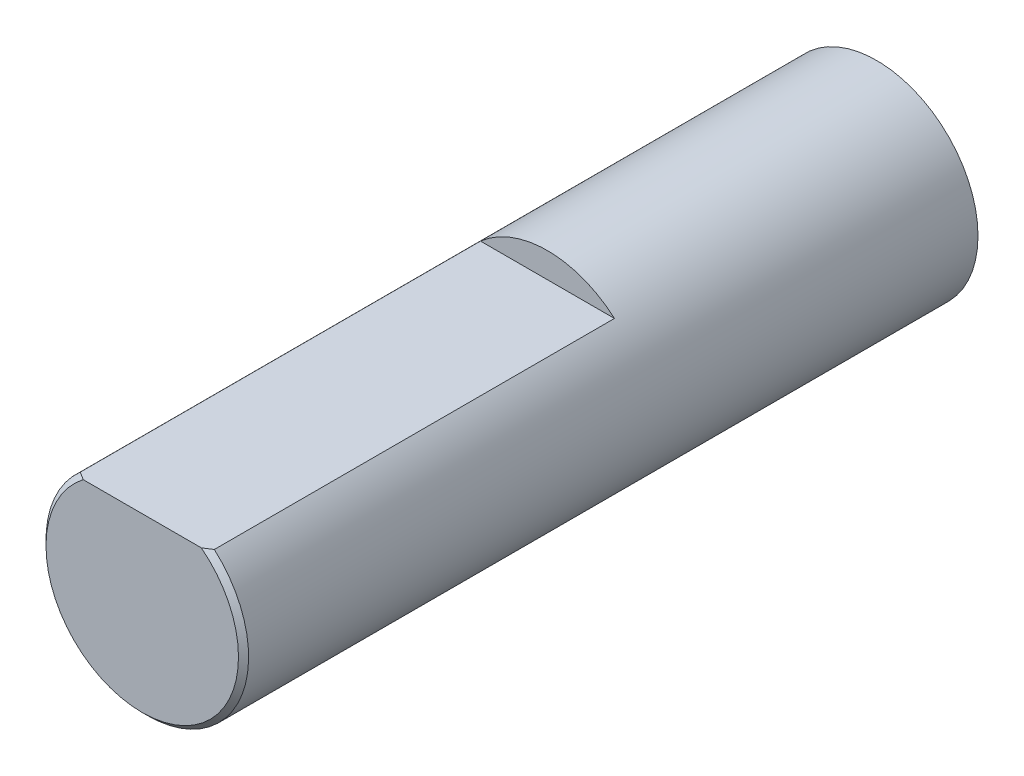
ISO-10303-21;
HEADER;
FILE_DESCRIPTION(('STEP AP214'),'2;1');
FILE_NAME('part.step','',(''),(''),'','','');
FILE_SCHEMA(('AUTOMOTIVE_DESIGN { 1 0 10303 214 1 1 1 1 }'));
ENDSEC;
DATA;
#1=APPLICATION_CONTEXT('core data for automotive mechanical design processes');
#2=APPLICATION_PROTOCOL_DEFINITION('international standard','automotive_design',2000,#1);
#3=PRODUCT_CONTEXT('',#1,'mechanical');
#4=PRODUCT('Part','Part','',(#3));
#5=PRODUCT_RELATED_PRODUCT_CATEGORY('part','',(#4));
#6=PRODUCT_DEFINITION_FORMATION('','',#4);
#7=PRODUCT_DEFINITION_CONTEXT('part definition',#1,'design');
#8=PRODUCT_DEFINITION('design','',#6,#7);
#9=PRODUCT_DEFINITION_SHAPE('','',#8);
#10=(LENGTH_UNIT() NAMED_UNIT(*) SI_UNIT(.MILLI.,.METRE.));
#11=(NAMED_UNIT(*) PLANE_ANGLE_UNIT() SI_UNIT($,.RADIAN.));
#12=(NAMED_UNIT(*) SI_UNIT($,.STERADIAN.) SOLID_ANGLE_UNIT());
#13=UNCERTAINTY_MEASURE_WITH_UNIT(LENGTH_MEASURE(1.E-05),#10,'distance_accuracy_value','');
#14=(GEOMETRIC_REPRESENTATION_CONTEXT(3) GLOBAL_UNCERTAINTY_ASSIGNED_CONTEXT((#13)) GLOBAL_UNIT_ASSIGNED_CONTEXT((#10,
#11,#12)) REPRESENTATION_CONTEXT('',''));
#15=CARTESIAN_POINT('',(0.,0.,0.));
#16=DIRECTION('',(0.,0.,1.));
#17=DIRECTION('',(1.,0.,0.));
#18=AXIS2_PLACEMENT_3D('',#15,#16,#17);
#19=CARTESIAN_POINT('',(0.,0.,14.5));
#20=DIRECTION('',(0.,0.,-1.));
#21=DIRECTION('',(-1.,0.,0.));
#22=AXIS2_PLACEMENT_3D('',#19,#20,#21);
#23=CYLINDRICAL_SURFACE('',#22,2.);
#24=DIRECTION('',(0.,0.,1.));
#25=VECTOR('',#24,1.);
#26=CARTESIAN_POINT('',(1.3228756555323,1.5,6.5));
#27=LINE('',#26,#25);
#28=CARTESIAN_POINT('',(1.3228756555323,1.5,6.5));
#29=VERTEX_POINT('',#28);
#30=CARTESIAN_POINT('',(1.3228756555323,1.5,14.4));
#31=VERTEX_POINT('',#30);
#32=EDGE_CURVE('E80',#29,#31,#27,.T.);
#33=ORIENTED_EDGE('',*,*,#32,.T.);
#34=CARTESIAN_POINT('',(0.,0.,14.4));
#35=DIRECTION('',(0.,0.,1.));
#36=DIRECTION('',(1.,0.,0.));
#37=AXIS2_PLACEMENT_3D('',#34,#35,#36);
#38=CIRCLE('',#37,2.);
#39=CARTESIAN_POINT('',(-1.3228756555323,1.5,14.4));
#40=VERTEX_POINT('',#39);
#41=EDGE_CURVE('E11',#31,#40,#38,.F.);
#42=ORIENTED_EDGE('',*,*,#41,.T.);
#43=DIRECTION('',(0.,0.,1.));
#44=VECTOR('',#43,1.);
#45=CARTESIAN_POINT('',(-1.3228756555323,1.5,6.5));
#46=LINE('',#45,#44);
#47=CARTESIAN_POINT('',(-1.3228756555323,1.5,6.5));
#48=VERTEX_POINT('',#47);
#49=EDGE_CURVE('E78',#48,#40,#46,.T.);
#50=ORIENTED_EDGE('',*,*,#49,.F.);
#51=CARTESIAN_POINT('',(0.,0.,6.5));
#52=DIRECTION('',(0.,0.,1.));
#53=DIRECTION('',(1.,0.,0.));
#54=AXIS2_PLACEMENT_3D('',#51,#52,#53);
#55=CIRCLE('',#54,2.);
#56=EDGE_CURVE('E71',#29,#48,#55,.T.);
#57=ORIENTED_EDGE('',*,*,#56,.F.);
#58=EDGE_LOOP('',(#33,#42,#50,#57));
#59=FACE_BOUND('',#58,.T.);
#60=CARTESIAN_POINT('',(0.,0.,0.));
#61=DIRECTION('',(0.,0.,1.));
#62=DIRECTION('',(1.,0.,0.));
#63=AXIS2_PLACEMENT_3D('',#60,#61,#62);
#64=CIRCLE('',#63,2.);
#65=CARTESIAN_POINT('',(2.,0.,0.));
#66=VERTEX_POINT('',#65);
#67=EDGE_CURVE('E84',#66,#66,#64,.T.);
#68=ORIENTED_EDGE('',*,*,#67,.T.);
#69=EDGE_LOOP('',(#68));
#70=FACE_BOUND('',#69,.T.);
#71=ADVANCED_FACE('F37',(#59,#70),#23,.T.);
#72=CARTESIAN_POINT('',(0.,0.,14.5));
#73=DIRECTION('',(0.,0.,1.));
#74=DIRECTION('',(1.,0.,0.));
#75=AXIS2_PLACEMENT_3D('',#72,#73,#74);
#76=PLANE('',#75);
#77=DIRECTION('',(1.,0.,0.));
#78=VECTOR('',#77,1.);
#79=CARTESIAN_POINT('',(-1.3228756555323,1.5,14.5));
#80=LINE('',#79,#78);
#81=CARTESIAN_POINT('',(-1.16619037896907,1.5,14.5));
#82=VERTEX_POINT('',#81);
#83=CARTESIAN_POINT('',(1.16619037896907,1.5,14.5));
#84=VERTEX_POINT('',#83);
#85=EDGE_CURVE('E75',#82,#84,#80,.T.);
#86=ORIENTED_EDGE('',*,*,#85,.F.);
#87=CARTESIAN_POINT('',(0.,0.,14.5));
#88=DIRECTION('',(0.,0.,1.));
#89=DIRECTION('',(1.,0.,0.));
#90=AXIS2_PLACEMENT_3D('',#87,#88,#89);
#91=CIRCLE('',#90,1.90000000000001);
#92=EDGE_CURVE('E90',#82,#84,#91,.T.);
#93=ORIENTED_EDGE('',*,*,#92,.T.);
#94=EDGE_LOOP('',(#86,#93));
#95=FACE_BOUND('',#94,.T.);
#96=ADVANCED_FACE('F108',(#95),#76,.T.);
#97=CARTESIAN_POINT('',(0.,0.,0.));
#98=DIRECTION('',(0.,0.,1.));
#99=DIRECTION('',(1.,0.,0.));
#100=AXIS2_PLACEMENT_3D('',#97,#98,#99);
#101=PLANE('',#100);
#102=ORIENTED_EDGE('',*,*,#67,.F.);
#103=EDGE_LOOP('',(#102));
#104=FACE_BOUND('',#103,.T.);
#105=ADVANCED_FACE('F107',(#104),#101,.F.);
#106=CARTESIAN_POINT('',(-1.3228756555323,1.5,6.5));
#107=DIRECTION('',(0.,-1.,0.));
#108=DIRECTION('',(0.,0.,-1.));
#109=AXIS2_PLACEMENT_3D('',#106,#107,#108);
#110=PLANE('',#109);
#111=ORIENTED_EDGE('',*,*,#85,.T.);
#112=CARTESIAN_POINT('',(1.16619037896907,1.5,14.5));
#113=CARTESIAN_POINT('',(1.19258664928351,1.5,14.483775170249));
#114=CARTESIAN_POINT('',(1.2188419145358,1.5,14.4673294063339));
#115=CARTESIAN_POINT('',(1.2710703390213,1.5,14.433996071378));
#116=CARTESIAN_POINT('',(1.29704349929008,1.5,14.4171085019597));
#117=CARTESIAN_POINT('',(1.3228756555323,1.5,14.4));
#118=B_SPLINE_CURVE_WITH_KNOTS('',3,(#112,#113,#114,#115,#116,#117),.UNSPECIFIED.,.F.,.F.,(4,2,
4),(0.,0.0929420192268238,0.185883697158989),.UNSPECIFIED.);
#119=EDGE_CURVE('E46',#84,#31,#118,.T.);
#120=ORIENTED_EDGE('',*,*,#119,.T.);
#121=ORIENTED_EDGE('',*,*,#32,.F.);
#122=DIRECTION('',(1.,0.,0.));
#123=VECTOR('',#122,1.);
#124=CARTESIAN_POINT('',(-1.3228756555323,1.5,6.5));
#125=LINE('',#124,#123);
#126=EDGE_CURVE('E74',#48,#29,#125,.T.);
#127=ORIENTED_EDGE('',*,*,#126,.F.);
#128=ORIENTED_EDGE('',*,*,#49,.T.);
#129=CARTESIAN_POINT('',(-1.3228756555323,1.5,14.4));
#130=CARTESIAN_POINT('',(-1.29704349929008,1.5,14.4171085019597));
#131=CARTESIAN_POINT('',(-1.2710703390213,1.5,14.433996071378));
#132=CARTESIAN_POINT('',(-1.2188419145358,1.5,14.4673294063339));
#133=CARTESIAN_POINT('',(-1.19258664928351,1.5,14.483775170249));
#134=CARTESIAN_POINT('',(-1.16619037896908,1.5,14.5));
#135=B_SPLINE_CURVE_WITH_KNOTS('',3,(#129,#130,#131,#132,#133,#134),.UNSPECIFIED.,.F.,.F.,(4,2,
4),(0.,0.0929416779321659,0.185883697158991),.UNSPECIFIED.);
#136=EDGE_CURVE('E93',#40,#82,#135,.T.);
#137=ORIENTED_EDGE('',*,*,#136,.T.);
#138=EDGE_LOOP('',(#111,#120,#121,#127,#128,#137));
#139=FACE_BOUND('',#138,.T.);
#140=ADVANCED_FACE('F77',(#139),#110,.F.);
#141=CARTESIAN_POINT('',(0.,0.,6.5));
#142=DIRECTION('',(0.,0.,1.));
#143=DIRECTION('',(1.,0.,0.));
#144=AXIS2_PLACEMENT_3D('',#141,#142,#143);
#145=PLANE('',#144);
#146=ORIENTED_EDGE('',*,*,#56,.T.);
#147=ORIENTED_EDGE('',*,*,#126,.T.);
#148=EDGE_LOOP('',(#146,#147));
#149=FACE_BOUND('',#148,.T.);
#150=ADVANCED_FACE('F73',(#149),#145,.T.);
#151=CARTESIAN_POINT('',(0.,0.,14.5));
#152=DIRECTION('',(0.,0.,-1.));
#153=DIRECTION('',(-1.,0.,0.));
#154=AXIS2_PLACEMENT_3D('',#151,#152,#153);
#155=CONICAL_SURFACE('',#154,1.90000000000001,0.785398163397442);
#156=ORIENTED_EDGE('',*,*,#136,.F.);
#157=ORIENTED_EDGE('',*,*,#41,.F.);
#158=ORIENTED_EDGE('',*,*,#119,.F.);
#159=ORIENTED_EDGE('',*,*,#92,.F.);
#160=EDGE_LOOP('',(#156,#157,#158,#159));
#161=FACE_BOUND('',#160,.T.);
#162=ADVANCED_FACE('F39',(#161),#155,.T.);
#163=CLOSED_SHELL('',(#71,#96,#105,#140,#150,#162));
#164=MANIFOLD_SOLID_BREP('B2',#163);
#165=ADVANCED_BREP_SHAPE_REPRESENTATION('',(#18,#164),#14);
#166=SHAPE_DEFINITION_REPRESENTATION(#9,#165);
ENDSEC;
END-ISO-10303-21;
